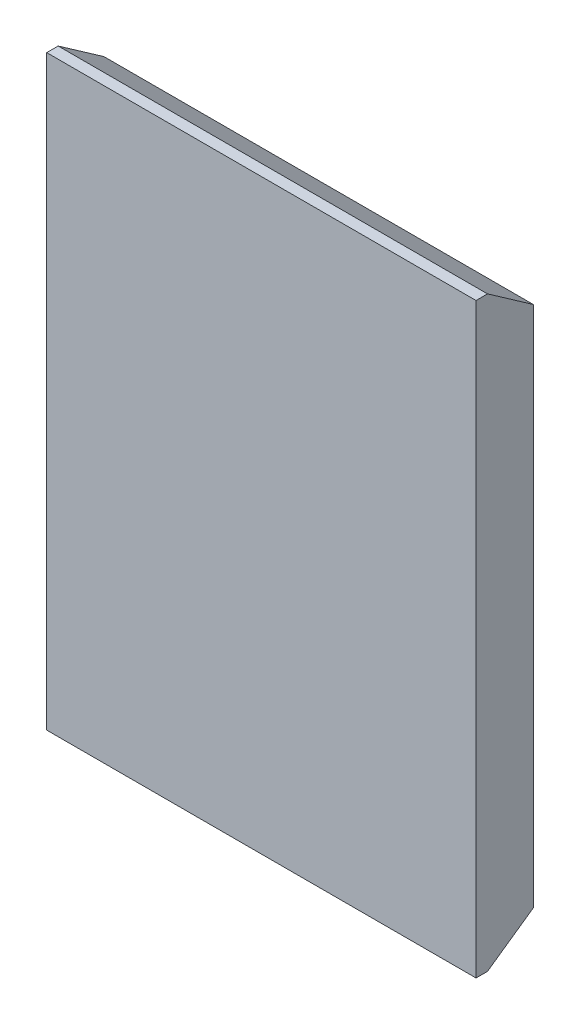
ISO-10303-21;
HEADER;
FILE_DESCRIPTION(('STEP AP214'),'2;1');
FILE_NAME('part.step','',(''),(''),'','','');
FILE_SCHEMA(('AUTOMOTIVE_DESIGN { 1 0 10303 214 1 1 1 1 }'));
ENDSEC;
DATA;
#1=APPLICATION_CONTEXT('core data for automotive mechanical design processes');
#2=APPLICATION_PROTOCOL_DEFINITION('international standard','automotive_design',2000,#1);
#3=PRODUCT_CONTEXT('',#1,'mechanical');
#4=PRODUCT('Part','Part','',(#3));
#5=PRODUCT_RELATED_PRODUCT_CATEGORY('part','',(#4));
#6=PRODUCT_DEFINITION_FORMATION('','',#4);
#7=PRODUCT_DEFINITION_CONTEXT('part definition',#1,'design');
#8=PRODUCT_DEFINITION('design','',#6,#7);
#9=PRODUCT_DEFINITION_SHAPE('','',#8);
#10=(LENGTH_UNIT() NAMED_UNIT(*) SI_UNIT(.MILLI.,.METRE.));
#11=(NAMED_UNIT(*) PLANE_ANGLE_UNIT() SI_UNIT($,.RADIAN.));
#12=(NAMED_UNIT(*) SI_UNIT($,.STERADIAN.) SOLID_ANGLE_UNIT());
#13=UNCERTAINTY_MEASURE_WITH_UNIT(LENGTH_MEASURE(1.E-05),#10,'distance_accuracy_value','');
#14=(GEOMETRIC_REPRESENTATION_CONTEXT(3) GLOBAL_UNCERTAINTY_ASSIGNED_CONTEXT((#13)) GLOBAL_UNIT_ASSIGNED_CONTEXT((#10,
#11,#12)) REPRESENTATION_CONTEXT('',''));
#15=CARTESIAN_POINT('',(0.,0.,0.));
#16=DIRECTION('',(0.,0.,1.));
#17=DIRECTION('',(1.,0.,0.));
#18=AXIS2_PLACEMENT_3D('',#15,#16,#17);
#19=CARTESIAN_POINT('',(75.,102.5,-20.));
#20=DIRECTION('',(1.,0.,0.));
#21=DIRECTION('',(0.,0.,-1.));
#22=AXIS2_PLACEMENT_3D('',#19,#20,#21);
#23=PLANE('',#22);
#24=DIRECTION('',(0.,0.,1.));
#25=VECTOR('',#24,1.);
#26=CARTESIAN_POINT('',(75.,-102.5,-20.));
#27=LINE('',#26,#25);
#28=CARTESIAN_POINT('',(75.,-102.5,-3.99999999999993));
#29=VERTEX_POINT('',#28);
#30=CARTESIAN_POINT('',(75.,-102.5,0.));
#31=VERTEX_POINT('',#30);
#32=EDGE_CURVE('E122',#29,#31,#27,.T.);
#33=ORIENTED_EDGE('',*,*,#32,.F.);
#34=DIRECTION('',(0.,0.573576436351045,-0.819152044288993));
#35=VECTOR('',#34,1.);
#36=CARTESIAN_POINT('',(75.,-27.539523724594,-111.054654777161));
#37=LINE('',#36,#35);
#38=CARTESIAN_POINT('',(75.,-91.2966793886445,-20.));
#39=VERTEX_POINT('',#38);
#40=EDGE_CURVE('E61',#29,#39,#37,.T.);
#41=ORIENTED_EDGE('',*,*,#40,.T.);
#42=DIRECTION('',(0.,1.,0.));
#43=VECTOR('',#42,1.);
#44=CARTESIAN_POINT('',(75.,102.5,-20.));
#45=LINE('',#44,#43);
#46=CARTESIAN_POINT('',(75.,91.2966793886446,-20.));
#47=VERTEX_POINT('',#46);
#48=EDGE_CURVE('E121',#39,#47,#45,.T.);
#49=ORIENTED_EDGE('',*,*,#48,.T.);
#50=DIRECTION('',(0.,0.573576436351045,0.819152044288993));
#51=VECTOR('',#50,1.);
#52=CARTESIAN_POINT('',(75.,94.9824590337127,-14.7361611466053));
#53=LINE('',#52,#51);
#54=CARTESIAN_POINT('',(75.,102.5,-3.99999999999993));
#55=VERTEX_POINT('',#54);
#56=EDGE_CURVE('E96',#47,#55,#53,.T.);
#57=ORIENTED_EDGE('',*,*,#56,.T.);
#58=DIRECTION('',(0.,0.,1.));
#59=VECTOR('',#58,1.);
#60=CARTESIAN_POINT('',(75.,102.5,-20.));
#61=LINE('',#60,#59);
#62=CARTESIAN_POINT('',(75.,102.5,0.));
#63=VERTEX_POINT('',#62);
#64=EDGE_CURVE('E90',#55,#63,#61,.T.);
#65=ORIENTED_EDGE('',*,*,#64,.T.);
#66=DIRECTION('',(0.,1.,0.));
#67=VECTOR('',#66,1.);
#68=CARTESIAN_POINT('',(75.,102.5,0.));
#69=LINE('',#68,#67);
#70=EDGE_CURVE('E93',#31,#63,#69,.T.);
#71=ORIENTED_EDGE('',*,*,#70,.F.);
#72=EDGE_LOOP('',(#33,#41,#49,#57,#65,#71));
#73=FACE_BOUND('',#72,.T.);
#74=ADVANCED_FACE('F39',(#73),#23,.T.);
#75=CARTESIAN_POINT('',(-75.,-102.5,-20.));
#76=DIRECTION('',(0.,-1.,0.));
#77=DIRECTION('',(0.,0.,-1.));
#78=AXIS2_PLACEMENT_3D('',#75,#76,#77);
#79=PLANE('',#78);
#80=DIRECTION('',(0.,0.,1.));
#81=VECTOR('',#80,1.);
#82=CARTESIAN_POINT('',(-75.,-102.5,-20.));
#83=LINE('',#82,#81);
#84=CARTESIAN_POINT('',(-75.,-102.5,-3.99999999999993));
#85=VERTEX_POINT('',#84);
#86=CARTESIAN_POINT('',(-75.,-102.5,0.));
#87=VERTEX_POINT('',#86);
#88=EDGE_CURVE('E125',#85,#87,#83,.T.);
#89=ORIENTED_EDGE('',*,*,#88,.F.);
#90=DIRECTION('',(1.,0.,0.));
#91=VECTOR('',#90,1.);
#92=CARTESIAN_POINT('',(75.,-102.5,-3.99999999999993));
#93=LINE('',#92,#91);
#94=EDGE_CURVE('E135',#85,#29,#93,.T.);
#95=ORIENTED_EDGE('',*,*,#94,.T.);
#96=ORIENTED_EDGE('',*,*,#32,.T.);
#97=DIRECTION('',(1.,0.,0.));
#98=VECTOR('',#97,1.);
#99=CARTESIAN_POINT('',(-75.,-102.5,0.));
#100=LINE('',#99,#98);
#101=EDGE_CURVE('E114',#87,#31,#100,.T.);
#102=ORIENTED_EDGE('',*,*,#101,.F.);
#103=EDGE_LOOP('',(#89,#95,#96,#102));
#104=FACE_BOUND('',#103,.T.);
#105=ADVANCED_FACE('F141',(#104),#79,.T.);
#106=CARTESIAN_POINT('',(-75.,102.5,-20.));
#107=DIRECTION('',(-1.,0.,0.));
#108=DIRECTION('',(0.,-1.,0.));
#109=AXIS2_PLACEMENT_3D('',#106,#107,#108);
#110=PLANE('',#109);
#111=DIRECTION('',(0.,-1.,0.));
#112=VECTOR('',#111,1.);
#113=CARTESIAN_POINT('',(-75.,102.5,-20.));
#114=LINE('',#113,#112);
#115=CARTESIAN_POINT('',(-75.,91.2966793886446,-20.));
#116=VERTEX_POINT('',#115);
#117=CARTESIAN_POINT('',(-75.,-91.2966793886445,-20.));
#118=VERTEX_POINT('',#117);
#119=EDGE_CURVE('E101',#116,#118,#114,.T.);
#120=ORIENTED_EDGE('',*,*,#119,.T.);
#121=DIRECTION('',(0.,-0.573576436351045,0.819152044288993));
#122=VECTOR('',#121,1.);
#123=CARTESIAN_POINT('',(-75.,-27.539523724594,-111.054654777161));
#124=LINE('',#123,#122);
#125=EDGE_CURVE('E11',#118,#85,#124,.T.);
#126=ORIENTED_EDGE('',*,*,#125,.T.);
#127=ORIENTED_EDGE('',*,*,#88,.T.);
#128=DIRECTION('',(0.,-1.,0.));
#129=VECTOR('',#128,1.);
#130=CARTESIAN_POINT('',(-75.,102.5,0.));
#131=LINE('',#130,#129);
#132=CARTESIAN_POINT('',(-75.,102.5,0.));
#133=VERTEX_POINT('',#132);
#134=EDGE_CURVE('E110',#133,#87,#131,.T.);
#135=ORIENTED_EDGE('',*,*,#134,.F.);
#136=DIRECTION('',(0.,0.,1.));
#137=VECTOR('',#136,1.);
#138=CARTESIAN_POINT('',(-75.,102.5,-20.));
#139=LINE('',#138,#137);
#140=CARTESIAN_POINT('',(-75.,102.5,-3.99999999999993));
#141=VERTEX_POINT('',#140);
#142=EDGE_CURVE('E100',#141,#133,#139,.T.);
#143=ORIENTED_EDGE('',*,*,#142,.F.);
#144=DIRECTION('',(0.,-0.573576436351045,-0.819152044288993));
#145=VECTOR('',#144,1.);
#146=CARTESIAN_POINT('',(-75.,94.9824590337127,-14.7361611466053));
#147=LINE('',#146,#145);
#148=EDGE_CURVE('E129',#141,#116,#147,.T.);
#149=ORIENTED_EDGE('',*,*,#148,.T.);
#150=EDGE_LOOP('',(#120,#126,#127,#135,#143,#149));
#151=FACE_BOUND('',#150,.T.);
#152=ADVANCED_FACE('F145',(#151),#110,.T.);
#153=CARTESIAN_POINT('',(-75.,102.5,-20.));
#154=DIRECTION('',(0.,1.,0.));
#155=DIRECTION('',(0.,0.,1.));
#156=AXIS2_PLACEMENT_3D('',#153,#154,#155);
#157=PLANE('',#156);
#158=ORIENTED_EDGE('',*,*,#64,.F.);
#159=DIRECTION('',(-1.,0.,0.));
#160=VECTOR('',#159,1.);
#161=CARTESIAN_POINT('',(-75.,102.5,-3.99999999999993));
#162=LINE('',#161,#160);
#163=EDGE_CURVE('E124',#55,#141,#162,.T.);
#164=ORIENTED_EDGE('',*,*,#163,.T.);
#165=ORIENTED_EDGE('',*,*,#142,.T.);
#166=DIRECTION('',(-1.,0.,0.));
#167=VECTOR('',#166,1.);
#168=CARTESIAN_POINT('',(-75.,102.5,0.));
#169=LINE('',#168,#167);
#170=EDGE_CURVE('E104',#63,#133,#169,.T.);
#171=ORIENTED_EDGE('',*,*,#170,.F.);
#172=EDGE_LOOP('',(#158,#164,#165,#171));
#173=FACE_BOUND('',#172,.T.);
#174=ADVANCED_FACE('F105',(#173),#157,.T.);
#175=CARTESIAN_POINT('',(0.,0.,-20.));
#176=DIRECTION('',(0.,0.,1.));
#177=DIRECTION('',(1.,0.,0.));
#178=AXIS2_PLACEMENT_3D('',#175,#176,#177);
#179=PLANE('',#178);
#180=ORIENTED_EDGE('',*,*,#48,.F.);
#181=DIRECTION('',(-1.,0.,0.));
#182=VECTOR('',#181,1.);
#183=CARTESIAN_POINT('',(-75.,-91.2966793886446,-20.));
#184=LINE('',#183,#182);
#185=EDGE_CURVE('E47',#39,#118,#184,.T.);
#186=ORIENTED_EDGE('',*,*,#185,.T.);
#187=ORIENTED_EDGE('',*,*,#119,.F.);
#188=DIRECTION('',(1.,0.,0.));
#189=VECTOR('',#188,1.);
#190=CARTESIAN_POINT('',(75.,91.2966793886446,-20.));
#191=LINE('',#190,#189);
#192=EDGE_CURVE('E131',#116,#47,#191,.T.);
#193=ORIENTED_EDGE('',*,*,#192,.T.);
#194=EDGE_LOOP('',(#180,#186,#187,#193));
#195=FACE_BOUND('',#194,.T.);
#196=ADVANCED_FACE('F147',(#195),#179,.F.);
#197=CARTESIAN_POINT('',(0.,0.,0.));
#198=DIRECTION('',(0.,0.,1.));
#199=DIRECTION('',(1.,0.,0.));
#200=AXIS2_PLACEMENT_3D('',#197,#198,#199);
#201=PLANE('',#200);
#202=ORIENTED_EDGE('',*,*,#70,.T.);
#203=ORIENTED_EDGE('',*,*,#170,.T.);
#204=ORIENTED_EDGE('',*,*,#134,.T.);
#205=ORIENTED_EDGE('',*,*,#101,.T.);
#206=EDGE_LOOP('',(#202,#203,#204,#205));
#207=FACE_BOUND('',#206,.T.);
#208=ADVANCED_FACE('F112',(#207),#201,.T.);
#209=CARTESIAN_POINT('',(-75.,102.5,-3.99999999999993));
#210=DIRECTION('',(0.,0.819152044288993,-0.573576436351045));
#211=DIRECTION('',(1.,0.,0.));
#212=AXIS2_PLACEMENT_3D('',#209,#210,#211);
#213=PLANE('',#212);
#214=ORIENTED_EDGE('',*,*,#56,.F.);
#215=ORIENTED_EDGE('',*,*,#192,.F.);
#216=ORIENTED_EDGE('',*,*,#148,.F.);
#217=ORIENTED_EDGE('',*,*,#163,.F.);
#218=EDGE_LOOP('',(#214,#215,#216,#217));
#219=FACE_BOUND('',#218,.T.);
#220=ADVANCED_FACE('F149',(#219),#213,.T.);
#221=CARTESIAN_POINT('',(-75.,-102.5,-3.99999999999993));
#222=DIRECTION('',(0.,-0.819152044288993,-0.573576436351045));
#223=DIRECTION('',(-1.,0.,0.));
#224=AXIS2_PLACEMENT_3D('',#221,#222,#223);
#225=PLANE('',#224);
#226=ORIENTED_EDGE('',*,*,#125,.F.);
#227=ORIENTED_EDGE('',*,*,#185,.F.);
#228=ORIENTED_EDGE('',*,*,#40,.F.);
#229=ORIENTED_EDGE('',*,*,#94,.F.);
#230=EDGE_LOOP('',(#226,#227,#228,#229));
#231=FACE_BOUND('',#230,.T.);
#232=ADVANCED_FACE('F41',(#231),#225,.T.);
#233=CLOSED_SHELL('',(#74,#105,#152,#174,#196,#208,#220,#232));
#234=MANIFOLD_SOLID_BREP('B2',#233);
#235=ADVANCED_BREP_SHAPE_REPRESENTATION('',(#18,#234),#14);
#236=SHAPE_DEFINITION_REPRESENTATION(#9,#235);
ENDSEC;
END-ISO-10303-21;
